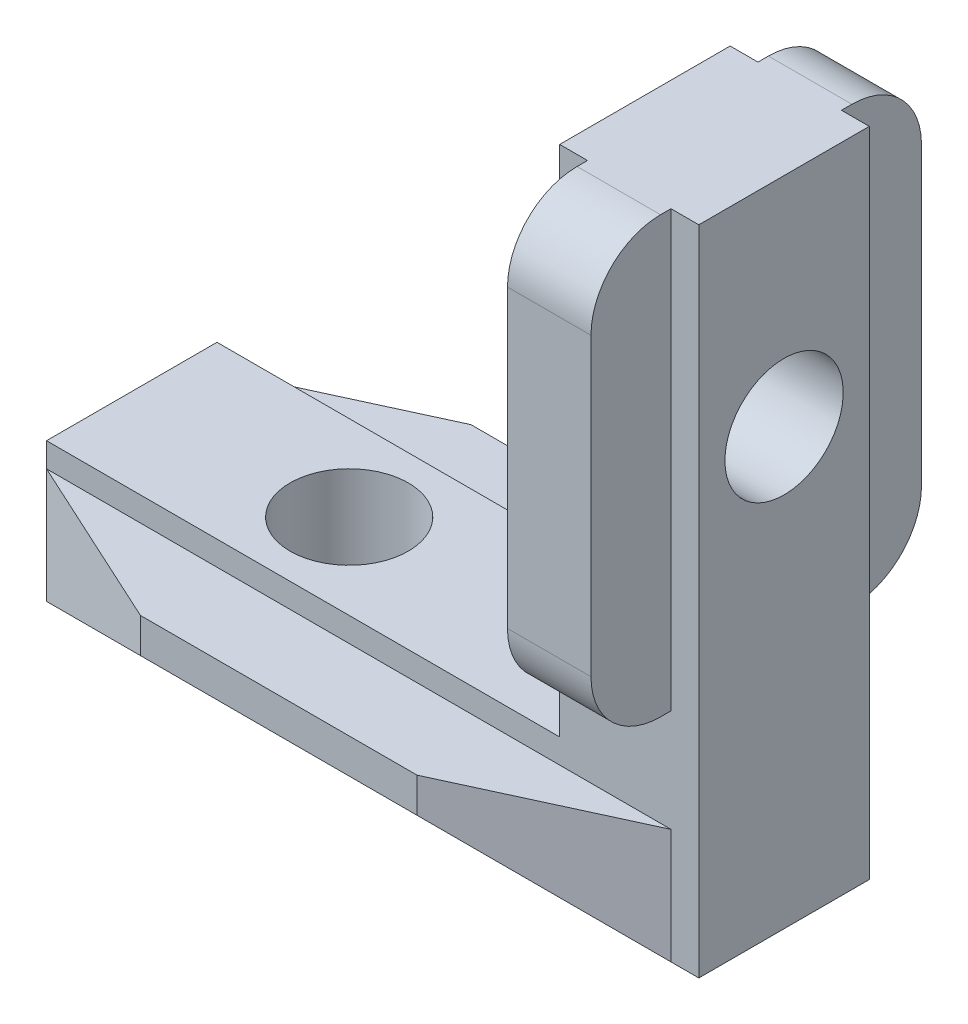
ISO-10303-21;
HEADER;
FILE_DESCRIPTION(('STEP AP214'),'2;1');
FILE_NAME('part.step','',(''),(''),'','','');
FILE_SCHEMA(('AUTOMOTIVE_DESIGN { 1 0 10303 214 1 1 1 1 }'));
ENDSEC;
DATA;
#1=APPLICATION_CONTEXT('core data for automotive mechanical design processes');
#2=APPLICATION_PROTOCOL_DEFINITION('international standard','automotive_design',2000,#1);
#3=PRODUCT_CONTEXT('',#1,'mechanical');
#4=PRODUCT('Part','Part','',(#3));
#5=PRODUCT_RELATED_PRODUCT_CATEGORY('part','',(#4));
#6=PRODUCT_DEFINITION_FORMATION('','',#4);
#7=PRODUCT_DEFINITION_CONTEXT('part definition',#1,'design');
#8=PRODUCT_DEFINITION('design','',#6,#7);
#9=PRODUCT_DEFINITION_SHAPE('','',#8);
#10=(LENGTH_UNIT() NAMED_UNIT(*) SI_UNIT(.MILLI.,.METRE.));
#11=(NAMED_UNIT(*) PLANE_ANGLE_UNIT() SI_UNIT($,.RADIAN.));
#12=(NAMED_UNIT(*) SI_UNIT($,.STERADIAN.) SOLID_ANGLE_UNIT());
#13=UNCERTAINTY_MEASURE_WITH_UNIT(LENGTH_MEASURE(1.E-05),#10,'distance_accuracy_value','');
#14=(GEOMETRIC_REPRESENTATION_CONTEXT(3) GLOBAL_UNCERTAINTY_ASSIGNED_CONTEXT((#13)) GLOBAL_UNIT_ASSIGNED_CONTEXT((#10,
#11,#12)) REPRESENTATION_CONTEXT('',''));
#15=CARTESIAN_POINT('',(0.,0.,0.));
#16=DIRECTION('',(0.,0.,1.));
#17=DIRECTION('',(1.,0.,0.));
#18=AXIS2_PLACEMENT_3D('',#15,#16,#17);
#19=CARTESIAN_POINT('',(0.,0.,4.9));
#20=DIRECTION('',(0.,0.,1.));
#21=DIRECTION('',(1.,0.,0.));
#22=AXIS2_PLACEMENT_3D('',#19,#20,#21);
#23=PLANE('',#22);
#24=DIRECTION('',(1.,0.,0.));
#25=VECTOR('',#24,1.);
#26=CARTESIAN_POINT('',(-6.4,12.5,4.9));
#27=LINE('',#26,#25);
#28=CARTESIAN_POINT('',(-6.4,12.5,4.9));
#29=VERTEX_POINT('',#28);
#30=CARTESIAN_POINT('',(-1.6,12.5,4.9));
#31=VERTEX_POINT('',#30);
#32=EDGE_CURVE('E52',#29,#31,#27,.T.);
#33=ORIENTED_EDGE('',*,*,#32,.F.);
#34=DIRECTION('',(0.,-1.,0.));
#35=VECTOR('',#34,1.);
#36=CARTESIAN_POINT('',(-6.4,12.5,4.9));
#37=LINE('',#36,#35);
#38=CARTESIAN_POINT('',(-6.4,37.5,4.9));
#39=VERTEX_POINT('',#38);
#40=EDGE_CURVE('E213',#39,#29,#37,.T.);
#41=ORIENTED_EDGE('',*,*,#40,.F.);
#42=DIRECTION('',(-1.,0.,0.));
#43=VECTOR('',#42,1.);
#44=CARTESIAN_POINT('',(-8.,37.5,4.9));
#45=LINE('',#44,#43);
#46=CARTESIAN_POINT('',(-8.,37.5,4.9));
#47=VERTEX_POINT('',#46);
#48=EDGE_CURVE('E211',#39,#47,#45,.T.);
#49=ORIENTED_EDGE('',*,*,#48,.T.);
#50=DIRECTION('',(0.,-1.,0.));
#51=VECTOR('',#50,1.);
#52=CARTESIAN_POINT('',(-8.,8.,4.9));
#53=LINE('',#52,#51);
#54=CARTESIAN_POINT('',(-8.,8.,4.9));
#55=VERTEX_POINT('',#54);
#56=EDGE_CURVE('E390',#47,#55,#53,.T.);
#57=ORIENTED_EDGE('',*,*,#56,.T.);
#58=DIRECTION('',(-1.,0.,0.));
#59=VECTOR('',#58,1.);
#60=CARTESIAN_POINT('',(-37.5,8.,4.9));
#61=LINE('',#60,#59);
#62=CARTESIAN_POINT('',(-37.5,8.,4.9));
#63=VERTEX_POINT('',#62);
#64=EDGE_CURVE('E392',#55,#63,#61,.T.);
#65=ORIENTED_EDGE('',*,*,#64,.T.);
#66=DIRECTION('',(0.,-1.,0.));
#67=VECTOR('',#66,1.);
#68=CARTESIAN_POINT('',(-37.5,8.,4.9));
#69=LINE('',#68,#67);
#70=CARTESIAN_POINT('',(-37.5,6.6,4.9));
#71=VERTEX_POINT('',#70);
#72=EDGE_CURVE('E375',#63,#71,#69,.T.);
#73=ORIENTED_EDGE('',*,*,#72,.T.);
#74=DIRECTION('',(-1.,0.,0.));
#75=VECTOR('',#74,1.);
#76=CARTESIAN_POINT('',(-1.6,6.6,4.9));
#77=LINE('',#76,#75);
#78=CARTESIAN_POINT('',(-1.6,6.6,4.9));
#79=VERTEX_POINT('',#78);
#80=EDGE_CURVE('E283',#79,#71,#77,.T.);
#81=ORIENTED_EDGE('',*,*,#80,.F.);
#82=DIRECTION('',(0.,-1.,0.));
#83=VECTOR('',#82,1.);
#84=CARTESIAN_POINT('',(-1.6,6.6,4.9));
#85=LINE('',#84,#83);
#86=CARTESIAN_POINT('',(-1.6,0.,4.9));
#87=VERTEX_POINT('',#86);
#88=EDGE_CURVE('E274',#79,#87,#85,.T.);
#89=ORIENTED_EDGE('',*,*,#88,.T.);
#90=DIRECTION('',(1.,0.,0.));
#91=VECTOR('',#90,1.);
#92=CARTESIAN_POINT('',(-37.5,0.,4.9));
#93=LINE('',#92,#91);
#94=CARTESIAN_POINT('',(0.,0.,4.9));
#95=VERTEX_POINT('',#94);
#96=EDGE_CURVE('E378',#87,#95,#93,.T.);
#97=ORIENTED_EDGE('',*,*,#96,.T.);
#98=DIRECTION('',(0.,1.,0.));
#99=VECTOR('',#98,1.);
#100=CARTESIAN_POINT('',(0.,0.,4.9));
#101=LINE('',#100,#99);
#102=CARTESIAN_POINT('',(0.,37.5,4.9));
#103=VERTEX_POINT('',#102);
#104=EDGE_CURVE('E385',#95,#103,#101,.T.);
#105=ORIENTED_EDGE('',*,*,#104,.T.);
#106=CARTESIAN_POINT('',(-1.6,37.5,4.9));
#107=VERTEX_POINT('',#106);
#108=EDGE_CURVE('E388',#103,#107,#45,.T.);
#109=ORIENTED_EDGE('',*,*,#108,.T.);
#110=DIRECTION('',(0.,-1.,0.));
#111=VECTOR('',#110,1.);
#112=CARTESIAN_POINT('',(-1.6,12.5,4.9));
#113=LINE('',#112,#111);
#114=EDGE_CURVE('E57',#107,#31,#113,.T.);
#115=ORIENTED_EDGE('',*,*,#114,.T.);
#116=EDGE_LOOP('',(#33,#41,#49,#57,#65,#73,#81,#89,#97,#105,#109,#115));
#117=FACE_BOUND('',#116,.T.);
#118=ADVANCED_FACE('F37',(#117),#23,.T.);
#119=CARTESIAN_POINT('',(-37.5,8.,4.9));
#120=DIRECTION('',(1.,0.,0.));
#121=DIRECTION('',(0.,0.,-1.));
#122=AXIS2_PLACEMENT_3D('',#119,#120,#121);
#123=PLANE('',#122);
#124=DIRECTION('',(0.,0.,-1.));
#125=VECTOR('',#124,1.);
#126=CARTESIAN_POINT('',(-37.5,0.,4.9));
#127=LINE('',#126,#125);
#128=CARTESIAN_POINT('',(-37.5,0.,4.9));
#129=VERTEX_POINT('',#128);
#130=CARTESIAN_POINT('',(-37.5,0.,-4.9));
#131=VERTEX_POINT('',#130);
#132=EDGE_CURVE('E296',#129,#131,#127,.T.);
#133=ORIENTED_EDGE('',*,*,#132,.F.);
#134=DIRECTION('',(0.,1.,0.));
#135=VECTOR('',#134,1.);
#136=CARTESIAN_POINT('',(-37.5,6.6,4.9));
#137=LINE('',#136,#135);
#138=EDGE_CURVE('E295',#129,#71,#137,.T.);
#139=ORIENTED_EDGE('',*,*,#138,.T.);
#140=ORIENTED_EDGE('',*,*,#72,.F.);
#141=DIRECTION('',(0.,0.,-1.));
#142=VECTOR('',#141,1.);
#143=CARTESIAN_POINT('',(-37.5,8.,4.9));
#144=LINE('',#143,#142);
#145=CARTESIAN_POINT('',(-37.5,8.,-4.9));
#146=VERTEX_POINT('',#145);
#147=EDGE_CURVE('E394',#63,#146,#144,.T.);
#148=ORIENTED_EDGE('',*,*,#147,.T.);
#149=DIRECTION('',(0.,-1.,0.));
#150=VECTOR('',#149,1.);
#151=CARTESIAN_POINT('',(-37.5,8.,-4.9));
#152=LINE('',#151,#150);
#153=CARTESIAN_POINT('',(-37.5,6.6,-4.9));
#154=VERTEX_POINT('',#153);
#155=EDGE_CURVE('E361',#146,#154,#152,.T.);
#156=ORIENTED_EDGE('',*,*,#155,.T.);
#157=DIRECTION('',(0.,-1.,0.));
#158=VECTOR('',#157,1.);
#159=CARTESIAN_POINT('',(-37.5,4.60000000000005,-4.9));
#160=LINE('',#159,#158);
#161=EDGE_CURVE('E292',#154,#131,#160,.T.);
#162=ORIENTED_EDGE('',*,*,#161,.T.);
#163=EDGE_LOOP('',(#133,#139,#140,#148,#156,#162));
#164=FACE_BOUND('',#163,.T.);
#165=ADVANCED_FACE('F438',(#164),#123,.F.);
#166=CARTESIAN_POINT('',(-37.5,0.,4.9));
#167=DIRECTION('',(0.,1.,0.));
#168=DIRECTION('',(0.,0.,1.));
#169=AXIS2_PLACEMENT_3D('',#166,#167,#168);
#170=PLANE('',#169);
#171=CARTESIAN_POINT('',(-25.,0.,0.));
#172=DIRECTION('',(0.,1.,0.));
#173=DIRECTION('',(0.,0.,1.));
#174=AXIS2_PLACEMENT_3D('',#171,#172,#173);
#175=CIRCLE('',#174,3.4);
#176=CARTESIAN_POINT('',(-25.,0.,3.4));
#177=VERTEX_POINT('',#176);
#178=EDGE_CURVE('E454',#177,#177,#175,.T.);
#179=ORIENTED_EDGE('',*,*,#178,.T.);
#180=EDGE_LOOP('',(#179));
#181=FACE_BOUND('',#180,.T.);
#182=DIRECTION('',(1.,0.,0.));
#183=VECTOR('',#182,1.);
#184=CARTESIAN_POINT('',(-37.5,0.,-4.9));
#185=LINE('',#184,#183);
#186=CARTESIAN_POINT('',(-1.6,0.,-4.9));
#187=VERTEX_POINT('',#186);
#188=EDGE_CURVE('E342',#131,#187,#185,.T.);
#189=ORIENTED_EDGE('',*,*,#188,.T.);
#190=CARTESIAN_POINT('',(0.,0.,-4.9));
#191=VERTEX_POINT('',#190);
#192=EDGE_CURVE('E351',#187,#191,#185,.T.);
#193=ORIENTED_EDGE('',*,*,#192,.T.);
#194=DIRECTION('',(0.,0.,-1.));
#195=VECTOR('',#194,1.);
#196=CARTESIAN_POINT('',(0.,0.,4.9));
#197=LINE('',#196,#195);
#198=EDGE_CURVE('E403',#95,#191,#197,.T.);
#199=ORIENTED_EDGE('',*,*,#198,.F.);
#200=ORIENTED_EDGE('',*,*,#96,.F.);
#201=EDGE_CURVE('E284',#129,#87,#93,.T.);
#202=ORIENTED_EDGE('',*,*,#201,.F.);
#203=ORIENTED_EDGE('',*,*,#132,.T.);
#204=EDGE_LOOP('',(#189,#193,#199,#200,#202,#203));
#205=FACE_BOUND('',#204,.T.);
#206=ADVANCED_FACE('F363',(#181,#205),#170,.F.);
#207=CARTESIAN_POINT('',(0.,0.,4.9));
#208=DIRECTION('',(-1.,0.,0.));
#209=DIRECTION('',(0.,0.,1.));
#210=AXIS2_PLACEMENT_3D('',#207,#208,#209);
#211=PLANE('',#210);
#212=CARTESIAN_POINT('',(0.,25.,0.));
#213=DIRECTION('',(-1.,0.,0.));
#214=DIRECTION('',(0.,0.,1.));
#215=AXIS2_PLACEMENT_3D('',#212,#213,#214);
#216=CIRCLE('',#215,3.4);
#217=CARTESIAN_POINT('',(0.,25.,3.4));
#218=VERTEX_POINT('',#217);
#219=EDGE_CURVE('E773',#218,#218,#216,.T.);
#220=ORIENTED_EDGE('',*,*,#219,.T.);
#221=EDGE_LOOP('',(#220));
#222=FACE_BOUND('',#221,.T.);
#223=DIRECTION('',(0.,1.,0.));
#224=VECTOR('',#223,1.);
#225=CARTESIAN_POINT('',(0.,0.,-4.9));
#226=LINE('',#225,#224);
#227=CARTESIAN_POINT('',(0.,37.5,-4.9));
#228=VERTEX_POINT('',#227);
#229=EDGE_CURVE('E357',#191,#228,#226,.T.);
#230=ORIENTED_EDGE('',*,*,#229,.T.);
#231=DIRECTION('',(0.,0.,-1.));
#232=VECTOR('',#231,1.);
#233=CARTESIAN_POINT('',(0.,37.5,4.9));
#234=LINE('',#233,#232);
#235=EDGE_CURVE('E405',#103,#228,#234,.T.);
#236=ORIENTED_EDGE('',*,*,#235,.F.);
#237=ORIENTED_EDGE('',*,*,#104,.F.);
#238=ORIENTED_EDGE('',*,*,#198,.T.);
#239=EDGE_LOOP('',(#230,#236,#237,#238));
#240=FACE_BOUND('',#239,.T.);
#241=ADVANCED_FACE('F509',(#222,#240),#211,.F.);
#242=CARTESIAN_POINT('',(-8.,37.5,4.9));
#243=DIRECTION('',(0.,-1.,0.));
#244=DIRECTION('',(0.,0.,-1.));
#245=AXIS2_PLACEMENT_3D('',#242,#243,#244);
#246=PLANE('',#245);
#247=DIRECTION('',(-1.,0.,0.));
#248=VECTOR('',#247,1.);
#249=CARTESIAN_POINT('',(-8.,37.5,-4.9));
#250=LINE('',#249,#248);
#251=CARTESIAN_POINT('',(-1.6,37.5,-4.9));
#252=VERTEX_POINT('',#251);
#253=EDGE_CURVE('E419',#228,#252,#250,.T.);
#254=ORIENTED_EDGE('',*,*,#253,.T.);
#255=DIRECTION('',(0.,0.,-1.));
#256=VECTOR('',#255,1.);
#257=CARTESIAN_POINT('',(-1.6,37.5,-4.9));
#258=LINE('',#257,#256);
#259=CARTESIAN_POINT('',(-1.6,37.5,-5.49999999999997));
#260=VERTEX_POINT('',#259);
#261=EDGE_CURVE('E230',#252,#260,#258,.T.);
#262=ORIENTED_EDGE('',*,*,#261,.T.);
#263=DIRECTION('',(1.,0.,0.));
#264=VECTOR('',#263,1.);
#265=CARTESIAN_POINT('',(-6.4,37.5,-5.49999999999997));
#266=LINE('',#265,#264);
#267=CARTESIAN_POINT('',(-6.4,37.5,-5.49999999999997));
#268=VERTEX_POINT('',#267);
#269=EDGE_CURVE('E271',#268,#260,#266,.T.);
#270=ORIENTED_EDGE('',*,*,#269,.F.);
#271=DIRECTION('',(0.,0.,-1.));
#272=VECTOR('',#271,1.);
#273=CARTESIAN_POINT('',(-6.4,37.5,-4.9));
#274=LINE('',#273,#272);
#275=CARTESIAN_POINT('',(-6.4,37.5,-4.9));
#276=VERTEX_POINT('',#275);
#277=EDGE_CURVE('E239',#276,#268,#274,.T.);
#278=ORIENTED_EDGE('',*,*,#277,.F.);
#279=CARTESIAN_POINT('',(-8.,37.5,-4.9));
#280=VERTEX_POINT('',#279);
#281=EDGE_CURVE('E420',#276,#280,#250,.T.);
#282=ORIENTED_EDGE('',*,*,#281,.T.);
#283=DIRECTION('',(0.,0.,-1.));
#284=VECTOR('',#283,1.);
#285=CARTESIAN_POINT('',(-8.,37.5,4.9));
#286=LINE('',#285,#284);
#287=EDGE_CURVE('E408',#47,#280,#286,.T.);
#288=ORIENTED_EDGE('',*,*,#287,.F.);
#289=ORIENTED_EDGE('',*,*,#48,.F.);
#290=DIRECTION('',(0.,0.,-1.));
#291=VECTOR('',#290,1.);
#292=CARTESIAN_POINT('',(-6.4,37.5,4.9));
#293=LINE('',#292,#291);
#294=CARTESIAN_POINT('',(-6.4,37.5,5.49999999999997));
#295=VERTEX_POINT('',#294);
#296=EDGE_CURVE('E202',#295,#39,#293,.T.);
#297=ORIENTED_EDGE('',*,*,#296,.F.);
#298=DIRECTION('',(1.,0.,0.));
#299=VECTOR('',#298,1.);
#300=CARTESIAN_POINT('',(-6.4,37.5,5.49999999999997));
#301=LINE('',#300,#299);
#302=CARTESIAN_POINT('',(-1.6,37.5,5.49999999999997));
#303=VERTEX_POINT('',#302);
#304=EDGE_CURVE('E208',#295,#303,#301,.T.);
#305=ORIENTED_EDGE('',*,*,#304,.T.);
#306=DIRECTION('',(0.,0.,-1.));
#307=VECTOR('',#306,1.);
#308=CARTESIAN_POINT('',(-1.6,37.5,4.9));
#309=LINE('',#308,#307);
#310=EDGE_CURVE('E453',#303,#107,#309,.T.);
#311=ORIENTED_EDGE('',*,*,#310,.T.);
#312=ORIENTED_EDGE('',*,*,#108,.F.);
#313=ORIENTED_EDGE('',*,*,#235,.T.);
#314=EDGE_LOOP('',(#254,#262,#270,#278,#282,#288,#289,#297,#305,#311,#312,#313));
#315=FACE_BOUND('',#314,.T.);
#316=ADVANCED_FACE('F205',(#315),#246,.F.);
#317=CARTESIAN_POINT('',(-8.,8.,4.9));
#318=DIRECTION('',(1.,0.,0.));
#319=DIRECTION('',(0.,0.,-1.));
#320=AXIS2_PLACEMENT_3D('',#317,#318,#319);
#321=PLANE('',#320);
#322=CARTESIAN_POINT('',(-7.99999999999999,25.,0.));
#323=DIRECTION('',(-1.,0.,0.));
#324=DIRECTION('',(0.,0.,1.));
#325=AXIS2_PLACEMENT_3D('',#322,#323,#324);
#326=CIRCLE('',#325,3.4);
#327=CARTESIAN_POINT('',(-7.99999999999999,25.,3.4));
#328=VERTEX_POINT('',#327);
#329=EDGE_CURVE('E770',#328,#328,#326,.T.);
#330=ORIENTED_EDGE('',*,*,#329,.F.);
#331=EDGE_LOOP('',(#330));
#332=FACE_BOUND('',#331,.T.);
#333=DIRECTION('',(0.,-1.,0.));
#334=VECTOR('',#333,1.);
#335=CARTESIAN_POINT('',(-8.,8.,-4.9));
#336=LINE('',#335,#334);
#337=CARTESIAN_POINT('',(-8.,8.,-4.9));
#338=VERTEX_POINT('',#337);
#339=EDGE_CURVE('E417',#280,#338,#336,.T.);
#340=ORIENTED_EDGE('',*,*,#339,.T.);
#341=DIRECTION('',(0.,0.,-1.));
#342=VECTOR('',#341,1.);
#343=CARTESIAN_POINT('',(-8.,8.,4.9));
#344=LINE('',#343,#342);
#345=EDGE_CURVE('E411',#55,#338,#344,.T.);
#346=ORIENTED_EDGE('',*,*,#345,.F.);
#347=ORIENTED_EDGE('',*,*,#56,.F.);
#348=ORIENTED_EDGE('',*,*,#287,.T.);
#349=EDGE_LOOP('',(#340,#346,#347,#348));
#350=FACE_BOUND('',#349,.T.);
#351=ADVANCED_FACE('F428',(#332,#350),#321,.F.);
#352=CARTESIAN_POINT('',(-37.5,8.,4.9));
#353=DIRECTION('',(0.,-1.,0.));
#354=DIRECTION('',(0.,0.,-1.));
#355=AXIS2_PLACEMENT_3D('',#352,#353,#354);
#356=PLANE('',#355);
#357=CARTESIAN_POINT('',(-25.,8.,0.));
#358=DIRECTION('',(0.,1.,0.));
#359=DIRECTION('',(0.,0.,1.));
#360=AXIS2_PLACEMENT_3D('',#357,#358,#359);
#361=CIRCLE('',#360,3.4);
#362=CARTESIAN_POINT('',(-25.,8.,3.4));
#363=VERTEX_POINT('',#362);
#364=EDGE_CURVE('E774',#363,#363,#361,.T.);
#365=ORIENTED_EDGE('',*,*,#364,.F.);
#366=EDGE_LOOP('',(#365));
#367=FACE_BOUND('',#366,.T.);
#368=DIRECTION('',(-1.,0.,0.));
#369=VECTOR('',#368,1.);
#370=CARTESIAN_POINT('',(-37.5,8.,-4.9));
#371=LINE('',#370,#369);
#372=EDGE_CURVE('E379',#338,#146,#371,.T.);
#373=ORIENTED_EDGE('',*,*,#372,.T.);
#374=ORIENTED_EDGE('',*,*,#147,.F.);
#375=ORIENTED_EDGE('',*,*,#64,.F.);
#376=ORIENTED_EDGE('',*,*,#345,.T.);
#377=EDGE_LOOP('',(#373,#374,#375,#376));
#378=FACE_BOUND('',#377,.T.);
#379=ADVANCED_FACE('F434',(#367,#378),#356,.F.);
#380=CARTESIAN_POINT('',(0.,0.,-4.9));
#381=DIRECTION('',(0.,0.,1.));
#382=DIRECTION('',(1.,0.,0.));
#383=AXIS2_PLACEMENT_3D('',#380,#381,#382);
#384=PLANE('',#383);
#385=ORIENTED_EDGE('',*,*,#281,.F.);
#386=DIRECTION('',(0.,1.,0.));
#387=VECTOR('',#386,1.);
#388=CARTESIAN_POINT('',(-6.4,12.5,-4.9));
#389=LINE('',#388,#387);
#390=CARTESIAN_POINT('',(-6.4,12.5,-4.9));
#391=VERTEX_POINT('',#390);
#392=EDGE_CURVE('E236',#391,#276,#389,.T.);
#393=ORIENTED_EDGE('',*,*,#392,.F.);
#394=DIRECTION('',(1.,0.,0.));
#395=VECTOR('',#394,1.);
#396=CARTESIAN_POINT('',(-6.4,12.5,-4.9));
#397=LINE('',#396,#395);
#398=CARTESIAN_POINT('',(-1.6,12.5,-4.9));
#399=VERTEX_POINT('',#398);
#400=EDGE_CURVE('E250',#391,#399,#397,.T.);
#401=ORIENTED_EDGE('',*,*,#400,.T.);
#402=DIRECTION('',(0.,1.,0.));
#403=VECTOR('',#402,1.);
#404=CARTESIAN_POINT('',(-1.6,12.5,-4.9));
#405=LINE('',#404,#403);
#406=EDGE_CURVE('E228',#399,#252,#405,.T.);
#407=ORIENTED_EDGE('',*,*,#406,.T.);
#408=ORIENTED_EDGE('',*,*,#253,.F.);
#409=ORIENTED_EDGE('',*,*,#229,.F.);
#410=ORIENTED_EDGE('',*,*,#192,.F.);
#411=DIRECTION('',(0.,1.,0.));
#412=VECTOR('',#411,1.);
#413=CARTESIAN_POINT('',(-1.6,6.6,-4.9));
#414=LINE('',#413,#412);
#415=CARTESIAN_POINT('',(-1.6,6.6,-4.9));
#416=VERTEX_POINT('',#415);
#417=EDGE_CURVE('E354',#187,#416,#414,.T.);
#418=ORIENTED_EDGE('',*,*,#417,.T.);
#419=DIRECTION('',(-1.,0.,0.));
#420=VECTOR('',#419,1.);
#421=CARTESIAN_POINT('',(-1.6,6.6,-4.9));
#422=LINE('',#421,#420);
#423=EDGE_CURVE('E367',#416,#154,#422,.T.);
#424=ORIENTED_EDGE('',*,*,#423,.T.);
#425=ORIENTED_EDGE('',*,*,#155,.F.);
#426=ORIENTED_EDGE('',*,*,#372,.F.);
#427=ORIENTED_EDGE('',*,*,#339,.F.);
#428=EDGE_LOOP('',(#385,#393,#401,#407,#408,#409,#410,#418,#424,#425,#426,#427));
#429=FACE_BOUND('',#428,.T.);
#430=ADVANCED_FACE('F352',(#429),#384,.F.);
#431=CARTESIAN_POINT('',(-1.6,0.,-4.9));
#432=DIRECTION('',(0.,-0.707106781186544,-0.707106781186551));
#433=DIRECTION('',(0.,0.707106781186551,-0.707106781186544));
#434=AXIS2_PLACEMENT_3D('',#431,#432,#433);
#435=PLANE('',#434);
#436=DIRECTION('',(-1.,0.,0.));
#437=VECTOR('',#436,1.);
#438=CARTESIAN_POINT('',(-1.6,4.60000000000005,-9.5));
#439=LINE('',#438,#437);
#440=CARTESIAN_POINT('',(-11.6000000000001,4.60000000000005,-9.5));
#441=VERTEX_POINT('',#440);
#442=CARTESIAN_POINT('',(-27.4999999999999,4.60000000000005,-9.5));
#443=VERTEX_POINT('',#442);
#444=EDGE_CURVE('E344',#441,#443,#439,.T.);
#445=ORIENTED_EDGE('',*,*,#444,.F.);
#446=DIRECTION('',(0.838237396964966,-0.385589202603886,0.385589202603882));
#447=VECTOR('',#446,1.);
#448=CARTESIAN_POINT('',(-1.6,0.,-4.9));
#449=LINE('',#448,#447);
#450=EDGE_CURVE('E45',#441,#187,#449,.T.);
#451=ORIENTED_EDGE('',*,*,#450,.T.);
#452=ORIENTED_EDGE('',*,*,#188,.F.);
#453=DIRECTION('',(0.838237396964966,0.385589202603886,-0.385589202603882));
#454=VECTOR('',#453,1.);
#455=CARTESIAN_POINT('',(-12.2751545812254,11.6034288926364,-16.5034288926362));
#456=LINE('',#455,#454);
#457=EDGE_CURVE('E313',#131,#443,#456,.T.);
#458=ORIENTED_EDGE('',*,*,#457,.T.);
#459=EDGE_LOOP('',(#445,#451,#452,#458));
#460=FACE_BOUND('',#459,.T.);
#461=ADVANCED_FACE('F340',(#460),#435,.T.);
#462=CARTESIAN_POINT('',(-1.6,4.60000000000005,-9.5));
#463=DIRECTION('',(0.,0.,-1.));
#464=DIRECTION('',(-1.,0.,0.));
#465=AXIS2_PLACEMENT_3D('',#462,#463,#464);
#466=PLANE('',#465);
#467=DIRECTION('',(-1.,0.,0.));
#468=VECTOR('',#467,1.);
#469=CARTESIAN_POINT('',(-1.6,6.6,-9.5));
#470=LINE('',#469,#468);
#471=CARTESIAN_POINT('',(-11.6000000000001,6.6,-9.5));
#472=VERTEX_POINT('',#471);
#473=CARTESIAN_POINT('',(-27.4999999999999,6.6,-9.5));
#474=VERTEX_POINT('',#473);
#475=EDGE_CURVE('E369',#472,#474,#470,.T.);
#476=ORIENTED_EDGE('',*,*,#475,.F.);
#477=DIRECTION('',(0.,-1.,0.));
#478=VECTOR('',#477,1.);
#479=CARTESIAN_POINT('',(-11.6000000000001,4.60000000000005,-9.5));
#480=LINE('',#479,#478);
#481=EDGE_CURVE('E330',#472,#441,#480,.T.);
#482=ORIENTED_EDGE('',*,*,#481,.T.);
#483=ORIENTED_EDGE('',*,*,#444,.T.);
#484=DIRECTION('',(0.,1.,0.));
#485=VECTOR('',#484,1.);
#486=CARTESIAN_POINT('',(-27.4999999999999,6.6,-9.5));
#487=LINE('',#486,#485);
#488=EDGE_CURVE('E316',#443,#474,#487,.T.);
#489=ORIENTED_EDGE('',*,*,#488,.T.);
#490=EDGE_LOOP('',(#476,#482,#483,#489));
#491=FACE_BOUND('',#490,.T.);
#492=ADVANCED_FACE('F546',(#491),#466,.T.);
#493=CARTESIAN_POINT('',(-1.6,6.6,-9.5));
#494=DIRECTION('',(0.,1.,0.));
#495=DIRECTION('',(0.,0.,1.));
#496=AXIS2_PLACEMENT_3D('',#493,#494,#495);
#497=PLANE('',#496);
#498=ORIENTED_EDGE('',*,*,#423,.F.);
#499=DIRECTION('',(-0.908490452678576,0.,-0.417905608232142));
#500=VECTOR('',#499,1.);
#501=CARTESIAN_POINT('',(-3.34645097391878,6.6,-5.70336744800263));
#502=LINE('',#501,#500);
#503=EDGE_CURVE('E11',#416,#472,#502,.T.);
#504=ORIENTED_EDGE('',*,*,#503,.T.);
#505=ORIENTED_EDGE('',*,*,#475,.T.);
#506=DIRECTION('',(-0.908490452678576,0.,0.417905608232142));
#507=VECTOR('',#506,1.);
#508=CARTESIAN_POINT('',(-6.12330802244959,6.6,-19.3332783096731));
#509=LINE('',#508,#507);
#510=EDGE_CURVE('E319',#474,#154,#509,.T.);
#511=ORIENTED_EDGE('',*,*,#510,.T.);
#512=EDGE_LOOP('',(#498,#504,#505,#511));
#513=FACE_BOUND('',#512,.T.);
#514=ADVANCED_FACE('F497',(#513),#497,.T.);
#515=CARTESIAN_POINT('',(-1.6,6.6,9.5));
#516=DIRECTION('',(0.,1.,0.));
#517=DIRECTION('',(0.,0.,1.));
#518=AXIS2_PLACEMENT_3D('',#515,#516,#517);
#519=PLANE('',#518);
#520=DIRECTION('',(-1.,0.,0.));
#521=VECTOR('',#520,1.);
#522=CARTESIAN_POINT('',(-1.6,6.6,9.5));
#523=LINE('',#522,#521);
#524=CARTESIAN_POINT('',(-11.6000000000001,6.6,9.5));
#525=VERTEX_POINT('',#524);
#526=CARTESIAN_POINT('',(-27.4999999999999,6.6,9.5));
#527=VERTEX_POINT('',#526);
#528=EDGE_CURVE('E277',#525,#527,#523,.T.);
#529=ORIENTED_EDGE('',*,*,#528,.F.);
#530=DIRECTION('',(0.908490452678576,0.,-0.417905608232142));
#531=VECTOR('',#530,1.);
#532=CARTESIAN_POINT('',(-3.34645097391878,6.6,5.70336744800263));
#533=LINE('',#532,#531);
#534=EDGE_CURVE('E326',#525,#79,#533,.T.);
#535=ORIENTED_EDGE('',*,*,#534,.T.);
#536=ORIENTED_EDGE('',*,*,#80,.T.);
#537=DIRECTION('',(0.908490452678576,0.,0.417905608232142));
#538=VECTOR('',#537,1.);
#539=CARTESIAN_POINT('',(-6.12330802244959,6.6,19.3332783096731));
#540=LINE('',#539,#538);
#541=EDGE_CURVE('E301',#71,#527,#540,.T.);
#542=ORIENTED_EDGE('',*,*,#541,.T.);
#543=EDGE_LOOP('',(#529,#535,#536,#542));
#544=FACE_BOUND('',#543,.T.);
#545=ADVANCED_FACE('F548',(#544),#519,.T.);
#546=CARTESIAN_POINT('',(-1.6,4.60000000000005,9.5));
#547=DIRECTION('',(0.,0.,1.));
#548=DIRECTION('',(1.,0.,0.));
#549=AXIS2_PLACEMENT_3D('',#546,#547,#548);
#550=PLANE('',#549);
#551=DIRECTION('',(-1.,0.,0.));
#552=VECTOR('',#551,1.);
#553=CARTESIAN_POINT('',(-1.6,4.60000000000005,9.5));
#554=LINE('',#553,#552);
#555=CARTESIAN_POINT('',(-11.6000000000001,4.60000000000005,9.5));
#556=VERTEX_POINT('',#555);
#557=CARTESIAN_POINT('',(-27.4999999999999,4.60000000000005,9.5));
#558=VERTEX_POINT('',#557);
#559=EDGE_CURVE('E289',#556,#558,#554,.T.);
#560=ORIENTED_EDGE('',*,*,#559,.F.);
#561=DIRECTION('',(0.,1.,0.));
#562=VECTOR('',#561,1.);
#563=CARTESIAN_POINT('',(-11.6000000000001,6.6,9.5));
#564=LINE('',#563,#562);
#565=EDGE_CURVE('E321',#556,#525,#564,.T.);
#566=ORIENTED_EDGE('',*,*,#565,.T.);
#567=ORIENTED_EDGE('',*,*,#528,.T.);
#568=DIRECTION('',(0.,-1.,0.));
#569=VECTOR('',#568,1.);
#570=CARTESIAN_POINT('',(-27.4999999999999,4.60000000000005,9.5));
#571=LINE('',#570,#569);
#572=EDGE_CURVE('E306',#527,#558,#571,.T.);
#573=ORIENTED_EDGE('',*,*,#572,.T.);
#574=EDGE_LOOP('',(#560,#566,#567,#573));
#575=FACE_BOUND('',#574,.T.);
#576=ADVANCED_FACE('F536',(#575),#550,.T.);
#577=CARTESIAN_POINT('',(-1.6,0.,4.9));
#578=DIRECTION('',(0.,-0.707106781186544,0.707106781186551));
#579=DIRECTION('',(0.,-0.707106781186551,-0.707106781186544));
#580=AXIS2_PLACEMENT_3D('',#577,#578,#579);
#581=PLANE('',#580);
#582=ORIENTED_EDGE('',*,*,#201,.T.);
#583=DIRECTION('',(-0.838237396964966,0.385589202603886,0.385589202603882));
#584=VECTOR('',#583,1.);
#585=CARTESIAN_POINT('',(-1.6,0.,4.9));
#586=LINE('',#585,#584);
#587=EDGE_CURVE('E328',#87,#556,#586,.T.);
#588=ORIENTED_EDGE('',*,*,#587,.T.);
#589=ORIENTED_EDGE('',*,*,#559,.T.);
#590=DIRECTION('',(-0.838237396964966,-0.385589202603886,-0.385589202603882));
#591=VECTOR('',#590,1.);
#592=CARTESIAN_POINT('',(-12.2751545812254,11.6034288926364,16.5034288926362));
#593=LINE('',#592,#591);
#594=EDGE_CURVE('E311',#558,#129,#593,.T.);
#595=ORIENTED_EDGE('',*,*,#594,.T.);
#596=EDGE_LOOP('',(#582,#588,#589,#595));
#597=FACE_BOUND('',#596,.T.);
#598=ADVANCED_FACE('F520',(#597),#581,.T.);
#599=CARTESIAN_POINT('',(-37.5,8.,4.9));
#600=DIRECTION('',(-0.417905608232142,0.,0.908490452678576));
#601=DIRECTION('',(0.,-1.,0.));
#602=AXIS2_PLACEMENT_3D('',#599,#600,#601);
#603=PLANE('',#602);
#604=ORIENTED_EDGE('',*,*,#594,.F.);
#605=ORIENTED_EDGE('',*,*,#572,.F.);
#606=ORIENTED_EDGE('',*,*,#541,.F.);
#607=ORIENTED_EDGE('',*,*,#138,.F.);
#608=EDGE_LOOP('',(#604,#605,#606,#607));
#609=FACE_BOUND('',#608,.T.);
#610=ADVANCED_FACE('F516',(#609),#603,.T.);
#611=CARTESIAN_POINT('',(-37.5,8.,-4.9));
#612=DIRECTION('',(-0.417905608232142,0.,-0.908490452678576));
#613=DIRECTION('',(0.,1.,0.));
#614=AXIS2_PLACEMENT_3D('',#611,#612,#613);
#615=PLANE('',#614);
#616=ORIENTED_EDGE('',*,*,#510,.F.);
#617=ORIENTED_EDGE('',*,*,#488,.F.);
#618=ORIENTED_EDGE('',*,*,#457,.F.);
#619=ORIENTED_EDGE('',*,*,#161,.F.);
#620=EDGE_LOOP('',(#616,#617,#618,#619));
#621=FACE_BOUND('',#620,.T.);
#622=ADVANCED_FACE('F519',(#621),#615,.T.);
#623=CARTESIAN_POINT('',(-11.6000000000001,4.60000000000005,9.5));
#624=DIRECTION('',(0.417905608232142,0.,0.908490452678576));
#625=DIRECTION('',(0.,-1.,0.));
#626=AXIS2_PLACEMENT_3D('',#623,#624,#625);
#627=PLANE('',#626);
#628=ORIENTED_EDGE('',*,*,#587,.F.);
#629=ORIENTED_EDGE('',*,*,#88,.F.);
#630=ORIENTED_EDGE('',*,*,#534,.F.);
#631=ORIENTED_EDGE('',*,*,#565,.F.);
#632=EDGE_LOOP('',(#628,#629,#630,#631));
#633=FACE_BOUND('',#632,.T.);
#634=ADVANCED_FACE('F523',(#633),#627,.T.);
#635=CARTESIAN_POINT('',(-11.6000000000001,4.60000000000005,-9.5));
#636=DIRECTION('',(0.417905608232142,0.,-0.908490452678576));
#637=DIRECTION('',(0.,1.,0.));
#638=AXIS2_PLACEMENT_3D('',#635,#636,#637);
#639=PLANE('',#638);
#640=ORIENTED_EDGE('',*,*,#503,.F.);
#641=ORIENTED_EDGE('',*,*,#417,.F.);
#642=ORIENTED_EDGE('',*,*,#450,.F.);
#643=ORIENTED_EDGE('',*,*,#481,.F.);
#644=EDGE_LOOP('',(#640,#641,#642,#643));
#645=FACE_BOUND('',#644,.T.);
#646=ADVANCED_FACE('F39',(#645),#639,.T.);
#647=CARTESIAN_POINT('',(-6.4,33.5,-5.5));
#648=DIRECTION('',(1.,0.,0.));
#649=DIRECTION('',(0.,0.,-1.));
#650=AXIS2_PLACEMENT_3D('',#647,#648,#649);
#651=CYLINDRICAL_SURFACE('',#650,4.);
#652=CARTESIAN_POINT('',(-1.6,33.5,-5.5));
#653=DIRECTION('',(-1.,0.,0.));
#654=DIRECTION('',(0.,0.,1.));
#655=AXIS2_PLACEMENT_3D('',#652,#653,#654);
#656=CIRCLE('',#655,4.);
#657=CARTESIAN_POINT('',(-1.6,33.5,-9.5));
#658=VERTEX_POINT('',#657);
#659=EDGE_CURVE('E253',#260,#658,#656,.T.);
#660=ORIENTED_EDGE('',*,*,#659,.T.);
#661=DIRECTION('',(1.,0.,0.));
#662=VECTOR('',#661,1.);
#663=CARTESIAN_POINT('',(-6.4,33.5,-9.5));
#664=LINE('',#663,#662);
#665=CARTESIAN_POINT('',(-6.4,33.5,-9.5));
#666=VERTEX_POINT('',#665);
#667=EDGE_CURVE('E268',#666,#658,#664,.T.);
#668=ORIENTED_EDGE('',*,*,#667,.F.);
#669=CARTESIAN_POINT('',(-6.4,33.5,-5.5));
#670=DIRECTION('',(-1.,0.,0.));
#671=DIRECTION('',(0.,0.,1.));
#672=AXIS2_PLACEMENT_3D('',#669,#670,#671);
#673=CIRCLE('',#672,4.);
#674=EDGE_CURVE('E242',#268,#666,#673,.T.);
#675=ORIENTED_EDGE('',*,*,#674,.F.);
#676=ORIENTED_EDGE('',*,*,#269,.T.);
#677=EDGE_LOOP('',(#660,#668,#675,#676));
#678=FACE_BOUND('',#677,.T.);
#679=ADVANCED_FACE('F530',(#678),#651,.T.);
#680=CARTESIAN_POINT('',(-6.4,33.5,-9.5));
#681=DIRECTION('',(0.,0.,1.));
#682=DIRECTION('',(0.,-1.,0.));
#683=AXIS2_PLACEMENT_3D('',#680,#681,#682);
#684=PLANE('',#683);
#685=DIRECTION('',(0.,-1.,0.));
#686=VECTOR('',#685,1.);
#687=CARTESIAN_POINT('',(-1.6,33.5,-9.5));
#688=LINE('',#687,#686);
#689=CARTESIAN_POINT('',(-1.6,16.5,-9.5));
#690=VERTEX_POINT('',#689);
#691=EDGE_CURVE('E255',#658,#690,#688,.T.);
#692=ORIENTED_EDGE('',*,*,#691,.T.);
#693=DIRECTION('',(1.,0.,0.));
#694=VECTOR('',#693,1.);
#695=CARTESIAN_POINT('',(-6.4,16.5,-9.5));
#696=LINE('',#695,#694);
#697=CARTESIAN_POINT('',(-6.4,16.5,-9.5));
#698=VERTEX_POINT('',#697);
#699=EDGE_CURVE('E265',#698,#690,#696,.T.);
#700=ORIENTED_EDGE('',*,*,#699,.F.);
#701=DIRECTION('',(0.,-1.,0.));
#702=VECTOR('',#701,1.);
#703=CARTESIAN_POINT('',(-6.4,33.5,-9.5));
#704=LINE('',#703,#702);
#705=EDGE_CURVE('E244',#666,#698,#704,.T.);
#706=ORIENTED_EDGE('',*,*,#705,.F.);
#707=ORIENTED_EDGE('',*,*,#667,.T.);
#708=EDGE_LOOP('',(#692,#700,#706,#707));
#709=FACE_BOUND('',#708,.T.);
#710=ADVANCED_FACE('F625',(#709),#684,.F.);
#711=CARTESIAN_POINT('',(-6.4,16.5,-5.5));
#712=DIRECTION('',(1.,0.,0.));
#713=DIRECTION('',(0.,0.,-1.));
#714=AXIS2_PLACEMENT_3D('',#711,#712,#713);
#715=CYLINDRICAL_SURFACE('',#714,4.);
#716=CARTESIAN_POINT('',(-1.6,16.5,-5.5));
#717=DIRECTION('',(-1.,0.,0.));
#718=DIRECTION('',(0.,0.,1.));
#719=AXIS2_PLACEMENT_3D('',#716,#717,#718);
#720=CIRCLE('',#719,4.);
#721=CARTESIAN_POINT('',(-1.6,12.5,-5.49999999999997));
#722=VERTEX_POINT('',#721);
#723=EDGE_CURVE('E257',#690,#722,#720,.T.);
#724=ORIENTED_EDGE('',*,*,#723,.T.);
#725=DIRECTION('',(1.,0.,0.));
#726=VECTOR('',#725,1.);
#727=CARTESIAN_POINT('',(-6.4,12.5,-5.49999999999997));
#728=LINE('',#727,#726);
#729=CARTESIAN_POINT('',(-6.4,12.5,-5.49999999999997));
#730=VERTEX_POINT('',#729);
#731=EDGE_CURVE('E262',#730,#722,#728,.T.);
#732=ORIENTED_EDGE('',*,*,#731,.F.);
#733=CARTESIAN_POINT('',(-6.4,16.5,-5.5));
#734=DIRECTION('',(-1.,0.,0.));
#735=DIRECTION('',(0.,0.,1.));
#736=AXIS2_PLACEMENT_3D('',#733,#734,#735);
#737=CIRCLE('',#736,4.);
#738=EDGE_CURVE('E246',#698,#730,#737,.T.);
#739=ORIENTED_EDGE('',*,*,#738,.F.);
#740=ORIENTED_EDGE('',*,*,#699,.T.);
#741=EDGE_LOOP('',(#724,#732,#739,#740));
#742=FACE_BOUND('',#741,.T.);
#743=ADVANCED_FACE('F635',(#742),#715,.T.);
#744=CARTESIAN_POINT('',(-6.4,12.5,-5.49999999999997));
#745=DIRECTION('',(0.,1.,0.));
#746=DIRECTION('',(0.,0.,1.));
#747=AXIS2_PLACEMENT_3D('',#744,#745,#746);
#748=PLANE('',#747);
#749=DIRECTION('',(0.,0.,1.));
#750=VECTOR('',#749,1.);
#751=CARTESIAN_POINT('',(-1.6,12.5,-5.49999999999997));
#752=LINE('',#751,#750);
#753=EDGE_CURVE('E240',#722,#399,#752,.T.);
#754=ORIENTED_EDGE('',*,*,#753,.T.);
#755=ORIENTED_EDGE('',*,*,#400,.F.);
#756=DIRECTION('',(0.,0.,1.));
#757=VECTOR('',#756,1.);
#758=CARTESIAN_POINT('',(-6.4,12.5,-5.49999999999997));
#759=LINE('',#758,#757);
#760=EDGE_CURVE('E248',#730,#391,#759,.T.);
#761=ORIENTED_EDGE('',*,*,#760,.F.);
#762=ORIENTED_EDGE('',*,*,#731,.T.);
#763=EDGE_LOOP('',(#754,#755,#761,#762));
#764=FACE_BOUND('',#763,.T.);
#765=ADVANCED_FACE('F645',(#764),#748,.F.);
#766=CARTESIAN_POINT('',(-6.4,33.5,-5.5));
#767=DIRECTION('',(-1.,0.,0.));
#768=DIRECTION('',(0.,0.,1.));
#769=AXIS2_PLACEMENT_3D('',#766,#767,#768);
#770=PLANE('',#769);
#771=ORIENTED_EDGE('',*,*,#392,.T.);
#772=ORIENTED_EDGE('',*,*,#277,.T.);
#773=ORIENTED_EDGE('',*,*,#674,.T.);
#774=ORIENTED_EDGE('',*,*,#705,.T.);
#775=ORIENTED_EDGE('',*,*,#738,.T.);
#776=ORIENTED_EDGE('',*,*,#760,.T.);
#777=EDGE_LOOP('',(#771,#772,#773,#774,#775,#776));
#778=FACE_BOUND('',#777,.T.);
#779=ADVANCED_FACE('F655',(#778),#770,.T.);
#780=CARTESIAN_POINT('',(-1.6,33.5,-5.5));
#781=DIRECTION('',(-1.,0.,0.));
#782=DIRECTION('',(0.,0.,1.));
#783=AXIS2_PLACEMENT_3D('',#780,#781,#782);
#784=PLANE('',#783);
#785=ORIENTED_EDGE('',*,*,#406,.F.);
#786=ORIENTED_EDGE('',*,*,#753,.F.);
#787=ORIENTED_EDGE('',*,*,#723,.F.);
#788=ORIENTED_EDGE('',*,*,#691,.F.);
#789=ORIENTED_EDGE('',*,*,#659,.F.);
#790=ORIENTED_EDGE('',*,*,#261,.F.);
#791=EDGE_LOOP('',(#785,#786,#787,#788,#789,#790));
#792=FACE_BOUND('',#791,.T.);
#793=ADVANCED_FACE('F665',(#792),#784,.F.);
#794=CARTESIAN_POINT('',(-6.4,33.5,5.5));
#795=DIRECTION('',(1.,0.,0.));
#796=DIRECTION('',(0.,0.,-1.));
#797=AXIS2_PLACEMENT_3D('',#794,#795,#796);
#798=CYLINDRICAL_SURFACE('',#797,4.);
#799=CARTESIAN_POINT('',(-1.6,33.5,5.5));
#800=DIRECTION('',(-1.,0.,0.));
#801=DIRECTION('',(0.,0.,-1.));
#802=AXIS2_PLACEMENT_3D('',#799,#800,#801);
#803=CIRCLE('',#802,4.);
#804=CARTESIAN_POINT('',(-1.6,33.5,9.5));
#805=VERTEX_POINT('',#804);
#806=EDGE_CURVE('E227',#805,#303,#803,.T.);
#807=ORIENTED_EDGE('',*,*,#806,.T.);
#808=ORIENTED_EDGE('',*,*,#304,.F.);
#809=CARTESIAN_POINT('',(-6.4,33.5,5.5));
#810=DIRECTION('',(-1.,0.,0.));
#811=DIRECTION('',(0.,0.,-1.));
#812=AXIS2_PLACEMENT_3D('',#809,#810,#811);
#813=CIRCLE('',#812,4.);
#814=CARTESIAN_POINT('',(-6.4,33.5,9.5));
#815=VERTEX_POINT('',#814);
#816=EDGE_CURVE('E214',#815,#295,#813,.T.);
#817=ORIENTED_EDGE('',*,*,#816,.F.);
#818=DIRECTION('',(1.,0.,0.));
#819=VECTOR('',#818,1.);
#820=CARTESIAN_POINT('',(-6.4,33.5,9.5));
#821=LINE('',#820,#819);
#822=EDGE_CURVE('E451',#815,#805,#821,.T.);
#823=ORIENTED_EDGE('',*,*,#822,.T.);
#824=EDGE_LOOP('',(#807,#808,#817,#823));
#825=FACE_BOUND('',#824,.T.);
#826=ADVANCED_FACE('F225',(#825),#798,.T.);
#827=CARTESIAN_POINT('',(-6.4,12.5,5.49999999999997));
#828=DIRECTION('',(0.,1.,0.));
#829=DIRECTION('',(0.,0.,1.));
#830=AXIS2_PLACEMENT_3D('',#827,#828,#829);
#831=PLANE('',#830);
#832=DIRECTION('',(0.,0.,1.));
#833=VECTOR('',#832,1.);
#834=CARTESIAN_POINT('',(-1.6,12.5,5.49999999999997));
#835=LINE('',#834,#833);
#836=CARTESIAN_POINT('',(-1.6,12.5,5.49999999999997));
#837=VERTEX_POINT('',#836);
#838=EDGE_CURVE('E457',#31,#837,#835,.T.);
#839=ORIENTED_EDGE('',*,*,#838,.T.);
#840=DIRECTION('',(1.,0.,0.));
#841=VECTOR('',#840,1.);
#842=CARTESIAN_POINT('',(-6.4,12.5,5.49999999999997));
#843=LINE('',#842,#841);
#844=CARTESIAN_POINT('',(-6.4,12.5,5.49999999999997));
#845=VERTEX_POINT('',#844);
#846=EDGE_CURVE('E232',#845,#837,#843,.T.);
#847=ORIENTED_EDGE('',*,*,#846,.F.);
#848=DIRECTION('',(0.,0.,1.));
#849=VECTOR('',#848,1.);
#850=CARTESIAN_POINT('',(-6.4,12.5,5.49999999999997));
#851=LINE('',#850,#849);
#852=EDGE_CURVE('E444',#29,#845,#851,.T.);
#853=ORIENTED_EDGE('',*,*,#852,.F.);
#854=ORIENTED_EDGE('',*,*,#32,.T.);
#855=EDGE_LOOP('',(#839,#847,#853,#854));
#856=FACE_BOUND('',#855,.T.);
#857=ADVANCED_FACE('F486',(#856),#831,.F.);
#858=CARTESIAN_POINT('',(-6.4,16.5,5.5));
#859=DIRECTION('',(1.,0.,0.));
#860=DIRECTION('',(0.,0.,-1.));
#861=AXIS2_PLACEMENT_3D('',#858,#859,#860);
#862=CYLINDRICAL_SURFACE('',#861,4.);
#863=CARTESIAN_POINT('',(-1.6,16.5,5.5));
#864=DIRECTION('',(-1.,0.,0.));
#865=DIRECTION('',(0.,0.,-1.));
#866=AXIS2_PLACEMENT_3D('',#863,#864,#865);
#867=CIRCLE('',#866,4.);
#868=CARTESIAN_POINT('',(-1.6,16.5,9.5));
#869=VERTEX_POINT('',#868);
#870=EDGE_CURVE('E459',#837,#869,#867,.T.);
#871=ORIENTED_EDGE('',*,*,#870,.T.);
#872=DIRECTION('',(1.,0.,0.));
#873=VECTOR('',#872,1.);
#874=CARTESIAN_POINT('',(-6.4,16.5,9.5));
#875=LINE('',#874,#873);
#876=CARTESIAN_POINT('',(-6.4,16.5,9.5));
#877=VERTEX_POINT('',#876);
#878=EDGE_CURVE('E463',#877,#869,#875,.T.);
#879=ORIENTED_EDGE('',*,*,#878,.F.);
#880=CARTESIAN_POINT('',(-6.4,16.5,5.5));
#881=DIRECTION('',(-1.,0.,0.));
#882=DIRECTION('',(0.,0.,-1.));
#883=AXIS2_PLACEMENT_3D('',#880,#881,#882);
#884=CIRCLE('',#883,4.);
#885=EDGE_CURVE('E446',#845,#877,#884,.T.);
#886=ORIENTED_EDGE('',*,*,#885,.F.);
#887=ORIENTED_EDGE('',*,*,#846,.T.);
#888=EDGE_LOOP('',(#871,#879,#886,#887));
#889=FACE_BOUND('',#888,.T.);
#890=ADVANCED_FACE('F470',(#889),#862,.T.);
#891=CARTESIAN_POINT('',(-6.4,33.5,9.5));
#892=DIRECTION('',(0.,0.,-1.));
#893=DIRECTION('',(0.,1.,0.));
#894=AXIS2_PLACEMENT_3D('',#891,#892,#893);
#895=PLANE('',#894);
#896=DIRECTION('',(0.,1.,0.));
#897=VECTOR('',#896,1.);
#898=CARTESIAN_POINT('',(-1.6,33.5,9.5));
#899=LINE('',#898,#897);
#900=EDGE_CURVE('E223',#869,#805,#899,.T.);
#901=ORIENTED_EDGE('',*,*,#900,.T.);
#902=ORIENTED_EDGE('',*,*,#822,.F.);
#903=DIRECTION('',(0.,1.,0.));
#904=VECTOR('',#903,1.);
#905=CARTESIAN_POINT('',(-6.4,33.5,9.5));
#906=LINE('',#905,#904);
#907=EDGE_CURVE('E219',#877,#815,#906,.T.);
#908=ORIENTED_EDGE('',*,*,#907,.F.);
#909=ORIENTED_EDGE('',*,*,#878,.T.);
#910=EDGE_LOOP('',(#901,#902,#908,#909));
#911=FACE_BOUND('',#910,.T.);
#912=ADVANCED_FACE('F478',(#911),#895,.F.);
#913=CARTESIAN_POINT('',(-6.4,33.5,5.5));
#914=DIRECTION('',(1.,0.,0.));
#915=DIRECTION('',(0.,0.,-1.));
#916=AXIS2_PLACEMENT_3D('',#913,#914,#915);
#917=PLANE('',#916);
#918=ORIENTED_EDGE('',*,*,#816,.T.);
#919=ORIENTED_EDGE('',*,*,#296,.T.);
#920=ORIENTED_EDGE('',*,*,#40,.T.);
#921=ORIENTED_EDGE('',*,*,#852,.T.);
#922=ORIENTED_EDGE('',*,*,#885,.T.);
#923=ORIENTED_EDGE('',*,*,#907,.T.);
#924=EDGE_LOOP('',(#918,#919,#920,#921,#922,#923));
#925=FACE_BOUND('',#924,.T.);
#926=ADVANCED_FACE('F217',(#925),#917,.F.);
#927=CARTESIAN_POINT('',(-1.6,33.5,5.5));
#928=DIRECTION('',(1.,0.,0.));
#929=DIRECTION('',(0.,0.,-1.));
#930=AXIS2_PLACEMENT_3D('',#927,#928,#929);
#931=PLANE('',#930);
#932=ORIENTED_EDGE('',*,*,#806,.F.);
#933=ORIENTED_EDGE('',*,*,#900,.F.);
#934=ORIENTED_EDGE('',*,*,#870,.F.);
#935=ORIENTED_EDGE('',*,*,#838,.F.);
#936=ORIENTED_EDGE('',*,*,#114,.F.);
#937=ORIENTED_EDGE('',*,*,#310,.F.);
#938=EDGE_LOOP('',(#932,#933,#934,#935,#936,#937));
#939=FACE_BOUND('',#938,.T.);
#940=ADVANCED_FACE('F476',(#939),#931,.T.);
#941=CARTESIAN_POINT('',(-25.,8.,0.));
#942=DIRECTION('',(0.,1.,0.));
#943=DIRECTION('',(0.,0.,1.));
#944=AXIS2_PLACEMENT_3D('',#941,#942,#943);
#945=CYLINDRICAL_SURFACE('',#944,3.4);
#946=ORIENTED_EDGE('',*,*,#364,.T.);
#947=EDGE_LOOP('',(#946));
#948=FACE_BOUND('',#947,.T.);
#949=ORIENTED_EDGE('',*,*,#178,.F.);
#950=EDGE_LOOP('',(#949));
#951=FACE_BOUND('',#950,.T.);
#952=ADVANCED_FACE('F716',(#948,#951),#945,.F.);
#953=CARTESIAN_POINT('',(-7.99999999999999,25.,0.));
#954=DIRECTION('',(-1.,0.,0.));
#955=DIRECTION('',(0.,0.,1.));
#956=AXIS2_PLACEMENT_3D('',#953,#954,#955);
#957=CYLINDRICAL_SURFACE('',#956,3.4);
#958=ORIENTED_EDGE('',*,*,#329,.T.);
#959=EDGE_LOOP('',(#958));
#960=FACE_BOUND('',#959,.T.);
#961=ORIENTED_EDGE('',*,*,#219,.F.);
#962=EDGE_LOOP('',(#961));
#963=FACE_BOUND('',#962,.T.);
#964=ADVANCED_FACE('F739',(#960,#963),#957,.F.);
#965=CLOSED_SHELL('',(#118,#165,#206,#241,#316,#351,#379,#430,#461,#492,#514,#545,#576,#598,
#610,#622,#634,#646,#679,#710,#743,#765,#779,#793,#826,#857,#890,#912,#926,#940,#952,#964));
#966=MANIFOLD_SOLID_BREP('B2',#965);
#967=ADVANCED_BREP_SHAPE_REPRESENTATION('',(#18,#966),#14);
#968=SHAPE_DEFINITION_REPRESENTATION(#9,#967);
ENDSEC;
END-ISO-10303-21;
